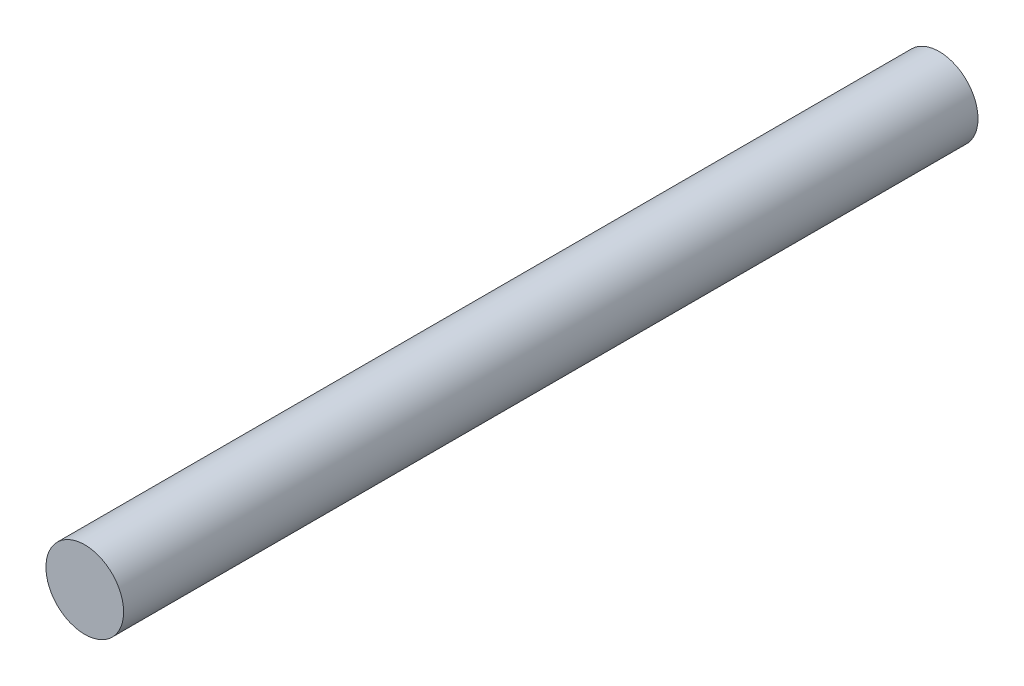
ISO-10303-21;
HEADER;
FILE_DESCRIPTION(('STEP AP214'),'2;1');
FILE_NAME('part.step','',(''),(''),'','','');
FILE_SCHEMA(('AUTOMOTIVE_DESIGN { 1 0 10303 214 1 1 1 1 }'));
ENDSEC;
DATA;
#1=APPLICATION_CONTEXT('core data for automotive mechanical design processes');
#2=APPLICATION_PROTOCOL_DEFINITION('international standard','automotive_design',2000,#1);
#3=PRODUCT_CONTEXT('',#1,'mechanical');
#4=PRODUCT('Part','Part','',(#3));
#5=PRODUCT_RELATED_PRODUCT_CATEGORY('part','',(#4));
#6=PRODUCT_DEFINITION_FORMATION('','',#4);
#7=PRODUCT_DEFINITION_CONTEXT('part definition',#1,'design');
#8=PRODUCT_DEFINITION('design','',#6,#7);
#9=PRODUCT_DEFINITION_SHAPE('','',#8);
#10=(LENGTH_UNIT() NAMED_UNIT(*) SI_UNIT(.MILLI.,.METRE.));
#11=(NAMED_UNIT(*) PLANE_ANGLE_UNIT() SI_UNIT($,.RADIAN.));
#12=(NAMED_UNIT(*) SI_UNIT($,.STERADIAN.) SOLID_ANGLE_UNIT());
#13=UNCERTAINTY_MEASURE_WITH_UNIT(LENGTH_MEASURE(1.E-05),#10,'distance_accuracy_value','');
#14=(GEOMETRIC_REPRESENTATION_CONTEXT(3) GLOBAL_UNCERTAINTY_ASSIGNED_CONTEXT((#13)) GLOBAL_UNIT_ASSIGNED_CONTEXT((#10,
#11,#12)) REPRESENTATION_CONTEXT('',''));
#15=CARTESIAN_POINT('',(0.,0.,0.));
#16=DIRECTION('',(0.,0.,1.));
#17=DIRECTION('',(1.,0.,0.));
#18=AXIS2_PLACEMENT_3D('',#15,#16,#17);
#19=CARTESIAN_POINT('',(0.,0.,110.));
#20=DIRECTION('',(0.,0.,-1.));
#21=DIRECTION('',(-1.,0.,0.));
#22=AXIS2_PLACEMENT_3D('',#19,#20,#21);
#23=CYLINDRICAL_SURFACE('',#22,5.);
#24=CARTESIAN_POINT('',(0.,0.,110.));
#25=DIRECTION('',(0.,0.,1.));
#26=DIRECTION('',(1.,0.,0.));
#27=AXIS2_PLACEMENT_3D('',#24,#25,#26);
#28=CIRCLE('',#27,5.);
#29=CARTESIAN_POINT('',(5.,0.,110.));
#30=VERTEX_POINT('',#29);
#31=EDGE_CURVE('E10',#30,#30,#28,.T.);
#32=ORIENTED_EDGE('',*,*,#31,.F.);
#33=EDGE_LOOP('',(#32));
#34=FACE_BOUND('',#33,.T.);
#35=CARTESIAN_POINT('',(0.,0.,0.));
#36=DIRECTION('',(0.,0.,1.));
#37=DIRECTION('',(1.,0.,0.));
#38=AXIS2_PLACEMENT_3D('',#35,#36,#37);
#39=CIRCLE('',#38,5.);
#40=CARTESIAN_POINT('',(5.,0.,0.));
#41=VERTEX_POINT('',#40);
#42=EDGE_CURVE('E37',#41,#41,#39,.T.);
#43=ORIENTED_EDGE('',*,*,#42,.T.);
#44=EDGE_LOOP('',(#43));
#45=FACE_BOUND('',#44,.T.);
#46=ADVANCED_FACE('F34',(#34,#45),#23,.T.);
#47=CARTESIAN_POINT('',(0.,0.,110.));
#48=DIRECTION('',(0.,0.,1.));
#49=DIRECTION('',(1.,0.,0.));
#50=AXIS2_PLACEMENT_3D('',#47,#48,#49);
#51=PLANE('',#50);
#52=ORIENTED_EDGE('',*,*,#31,.T.);
#53=EDGE_LOOP('',(#52));
#54=FACE_BOUND('',#53,.T.);
#55=ADVANCED_FACE('F49',(#54),#51,.T.);
#56=CARTESIAN_POINT('',(0.,0.,0.));
#57=DIRECTION('',(0.,0.,1.));
#58=DIRECTION('',(1.,0.,0.));
#59=AXIS2_PLACEMENT_3D('',#56,#57,#58);
#60=PLANE('',#59);
#61=ORIENTED_EDGE('',*,*,#42,.F.);
#62=EDGE_LOOP('',(#61));
#63=FACE_BOUND('',#62,.T.);
#64=ADVANCED_FACE('F47',(#63),#60,.F.);
#65=CLOSED_SHELL('',(#46,#55,#64));
#66=MANIFOLD_SOLID_BREP('B2',#65);
#67=ADVANCED_BREP_SHAPE_REPRESENTATION('',(#18,#66),#14);
#68=SHAPE_DEFINITION_REPRESENTATION(#9,#67);
ENDSEC;
END-ISO-10303-21;
